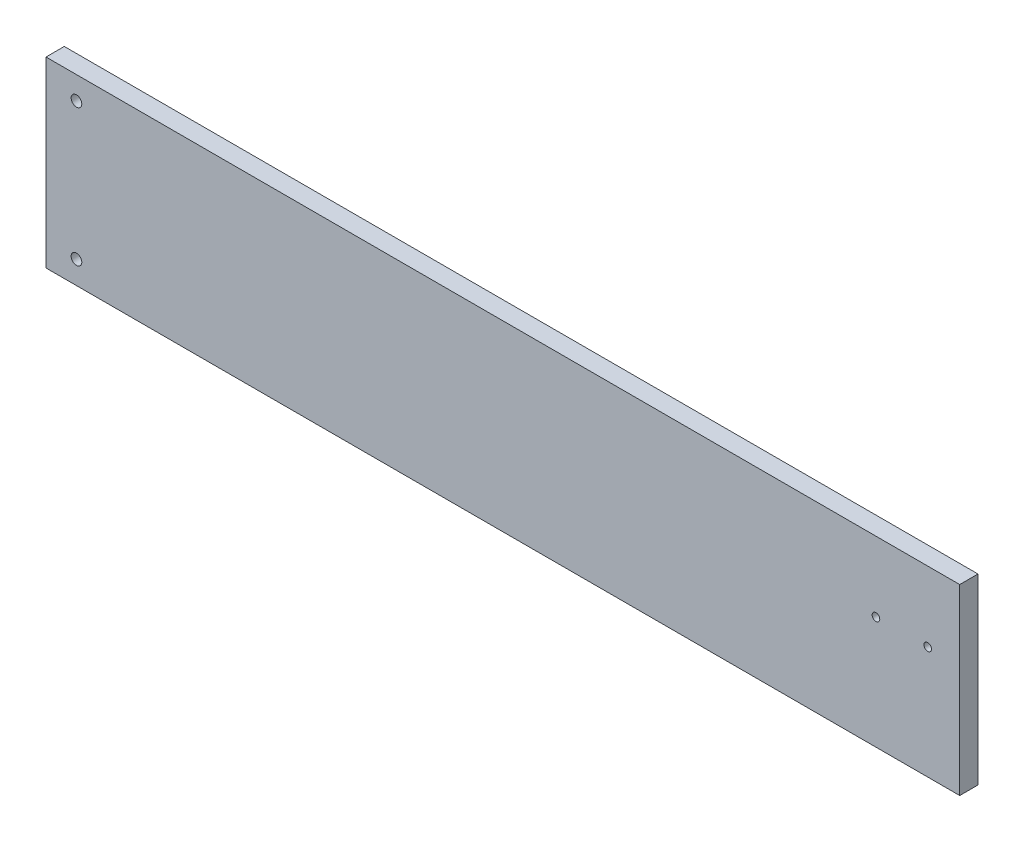
ISO-10303-21;
HEADER;
FILE_DESCRIPTION(('STEP AP214'),'2;1');
FILE_NAME('part.step','',(''),(''),'','','');
FILE_SCHEMA(('AUTOMOTIVE_DESIGN { 1 0 10303 214 1 1 1 1 }'));
ENDSEC;
DATA;
#1=APPLICATION_CONTEXT('core data for automotive mechanical design processes');
#2=APPLICATION_PROTOCOL_DEFINITION('international standard','automotive_design',2000,#1);
#3=PRODUCT_CONTEXT('',#1,'mechanical');
#4=PRODUCT('Part','Part','',(#3));
#5=PRODUCT_RELATED_PRODUCT_CATEGORY('part','',(#4));
#6=PRODUCT_DEFINITION_FORMATION('','',#4);
#7=PRODUCT_DEFINITION_CONTEXT('part definition',#1,'design');
#8=PRODUCT_DEFINITION('design','',#6,#7);
#9=PRODUCT_DEFINITION_SHAPE('','',#8);
#10=(LENGTH_UNIT() NAMED_UNIT(*) SI_UNIT(.MILLI.,.METRE.));
#11=(NAMED_UNIT(*) PLANE_ANGLE_UNIT() SI_UNIT($,.RADIAN.));
#12=(NAMED_UNIT(*) SI_UNIT($,.STERADIAN.) SOLID_ANGLE_UNIT());
#13=UNCERTAINTY_MEASURE_WITH_UNIT(LENGTH_MEASURE(1.E-05),#10,'distance_accuracy_value','');
#14=(GEOMETRIC_REPRESENTATION_CONTEXT(3) GLOBAL_UNCERTAINTY_ASSIGNED_CONTEXT((#13)) GLOBAL_UNIT_ASSIGNED_CONTEXT((#10,
#11,#12)) REPRESENTATION_CONTEXT('',''));
#15=CARTESIAN_POINT('',(0.,0.,0.));
#16=DIRECTION('',(0.,0.,1.));
#17=DIRECTION('',(1.,0.,0.));
#18=AXIS2_PLACEMENT_3D('',#15,#16,#17);
#19=CARTESIAN_POINT('',(0.,0.,12.));
#20=DIRECTION('',(1.,0.,0.));
#21=DIRECTION('',(0.,0.,-1.));
#22=AXIS2_PLACEMENT_3D('',#19,#20,#21);
#23=PLANE('',#22);
#24=DIRECTION('',(0.,-1.,0.));
#25=VECTOR('',#24,1.);
#26=CARTESIAN_POINT('',(0.,0.,0.));
#27=LINE('',#26,#25);
#28=CARTESIAN_POINT('',(0.,120.,0.));
#29=VERTEX_POINT('',#28);
#30=CARTESIAN_POINT('',(0.,0.,0.));
#31=VERTEX_POINT('',#30);
#32=EDGE_CURVE('E98',#29,#31,#27,.T.);
#33=ORIENTED_EDGE('',*,*,#32,.T.);
#34=DIRECTION('',(0.,0.,-1.));
#35=VECTOR('',#34,1.);
#36=CARTESIAN_POINT('',(0.,0.,12.));
#37=LINE('',#36,#35);
#38=CARTESIAN_POINT('',(0.,0.,12.));
#39=VERTEX_POINT('',#38);
#40=EDGE_CURVE('E11',#39,#31,#37,.T.);
#41=ORIENTED_EDGE('',*,*,#40,.F.);
#42=DIRECTION('',(0.,-1.,0.));
#43=VECTOR('',#42,1.);
#44=CARTESIAN_POINT('',(0.,0.,12.));
#45=LINE('',#44,#43);
#46=CARTESIAN_POINT('',(0.,120.,12.));
#47=VERTEX_POINT('',#46);
#48=EDGE_CURVE('E86',#47,#39,#45,.T.);
#49=ORIENTED_EDGE('',*,*,#48,.F.);
#50=DIRECTION('',(0.,0.,-1.));
#51=VECTOR('',#50,1.);
#52=CARTESIAN_POINT('',(0.,120.,12.));
#53=LINE('',#52,#51);
#54=EDGE_CURVE('E94',#47,#29,#53,.T.);
#55=ORIENTED_EDGE('',*,*,#54,.T.);
#56=EDGE_LOOP('',(#33,#41,#49,#55));
#57=FACE_BOUND('',#56,.T.);
#58=ADVANCED_FACE('F35',(#57),#23,.F.);
#59=CARTESIAN_POINT('',(0.,0.,12.));
#60=DIRECTION('',(0.,1.,0.));
#61=DIRECTION('',(0.,0.,1.));
#62=AXIS2_PLACEMENT_3D('',#59,#60,#61);
#63=PLANE('',#62);
#64=DIRECTION('',(1.,0.,0.));
#65=VECTOR('',#64,1.);
#66=CARTESIAN_POINT('',(0.,0.,0.));
#67=LINE('',#66,#65);
#68=CARTESIAN_POINT('',(600.,0.,0.));
#69=VERTEX_POINT('',#68);
#70=EDGE_CURVE('E90',#31,#69,#67,.T.);
#71=ORIENTED_EDGE('',*,*,#70,.T.);
#72=DIRECTION('',(0.,0.,-1.));
#73=VECTOR('',#72,1.);
#74=CARTESIAN_POINT('',(600.,0.,12.));
#75=LINE('',#74,#73);
#76=CARTESIAN_POINT('',(600.,0.,12.));
#77=VERTEX_POINT('',#76);
#78=EDGE_CURVE('E43',#77,#69,#75,.T.);
#79=ORIENTED_EDGE('',*,*,#78,.F.);
#80=DIRECTION('',(1.,0.,0.));
#81=VECTOR('',#80,1.);
#82=CARTESIAN_POINT('',(0.,0.,12.));
#83=LINE('',#82,#81);
#84=EDGE_CURVE('E81',#39,#77,#83,.T.);
#85=ORIENTED_EDGE('',*,*,#84,.F.);
#86=ORIENTED_EDGE('',*,*,#40,.T.);
#87=EDGE_LOOP('',(#71,#79,#85,#86));
#88=FACE_BOUND('',#87,.T.);
#89=ADVANCED_FACE('F89',(#88),#63,.F.);
#90=CARTESIAN_POINT('',(600.,0.,12.));
#91=DIRECTION('',(-1.,0.,0.));
#92=DIRECTION('',(0.,0.,1.));
#93=AXIS2_PLACEMENT_3D('',#90,#91,#92);
#94=PLANE('',#93);
#95=DIRECTION('',(0.,1.,0.));
#96=VECTOR('',#95,1.);
#97=CARTESIAN_POINT('',(600.,0.,0.));
#98=LINE('',#97,#96);
#99=CARTESIAN_POINT('',(600.,120.,0.));
#100=VERTEX_POINT('',#99);
#101=EDGE_CURVE('E68',#69,#100,#98,.T.);
#102=ORIENTED_EDGE('',*,*,#101,.T.);
#103=DIRECTION('',(0.,0.,-1.));
#104=VECTOR('',#103,1.);
#105=CARTESIAN_POINT('',(600.,120.,12.));
#106=LINE('',#105,#104);
#107=CARTESIAN_POINT('',(600.,120.,12.));
#108=VERTEX_POINT('',#107);
#109=EDGE_CURVE('E91',#108,#100,#106,.T.);
#110=ORIENTED_EDGE('',*,*,#109,.F.);
#111=DIRECTION('',(0.,1.,0.));
#112=VECTOR('',#111,1.);
#113=CARTESIAN_POINT('',(600.,0.,12.));
#114=LINE('',#113,#112);
#115=EDGE_CURVE('E84',#77,#108,#114,.T.);
#116=ORIENTED_EDGE('',*,*,#115,.F.);
#117=ORIENTED_EDGE('',*,*,#78,.T.);
#118=EDGE_LOOP('',(#102,#110,#116,#117));
#119=FACE_BOUND('',#118,.T.);
#120=ADVANCED_FACE('F92',(#119),#94,.F.);
#121=CARTESIAN_POINT('',(0.,120.,12.));
#122=DIRECTION('',(0.,-1.,0.));
#123=DIRECTION('',(0.,0.,-1.));
#124=AXIS2_PLACEMENT_3D('',#121,#122,#123);
#125=PLANE('',#124);
#126=DIRECTION('',(-1.,0.,0.));
#127=VECTOR('',#126,1.);
#128=CARTESIAN_POINT('',(0.,120.,0.));
#129=LINE('',#128,#127);
#130=EDGE_CURVE('E74',#100,#29,#129,.T.);
#131=ORIENTED_EDGE('',*,*,#130,.T.);
#132=ORIENTED_EDGE('',*,*,#54,.F.);
#133=DIRECTION('',(-1.,0.,0.));
#134=VECTOR('',#133,1.);
#135=CARTESIAN_POINT('',(0.,120.,12.));
#136=LINE('',#135,#134);
#137=EDGE_CURVE('E51',#108,#47,#136,.T.);
#138=ORIENTED_EDGE('',*,*,#137,.F.);
#139=ORIENTED_EDGE('',*,*,#109,.T.);
#140=EDGE_LOOP('',(#131,#132,#138,#139));
#141=FACE_BOUND('',#140,.T.);
#142=ADVANCED_FACE('F106',(#141),#125,.F.);
#143=CARTESIAN_POINT('',(0.,120.,12.));
#144=DIRECTION('',(0.,0.,-1.));
#145=DIRECTION('',(-1.,0.,0.));
#146=AXIS2_PLACEMENT_3D('',#143,#144,#145);
#147=PLANE('',#146);
#148=CARTESIAN_POINT('',(579.,74.,12.0000000000004));
#149=DIRECTION('',(0.,0.,-1.));
#150=DIRECTION('',(-1.,0.,0.));
#151=AXIS2_PLACEMENT_3D('',#148,#149,#150);
#152=CIRCLE('',#151,2.49999999999995);
#153=CARTESIAN_POINT('',(576.5,74.,12.0000000000004));
#154=VERTEX_POINT('',#153);
#155=EDGE_CURVE('E129',#154,#154,#152,.T.);
#156=ORIENTED_EDGE('',*,*,#155,.T.);
#157=EDGE_LOOP('',(#156));
#158=FACE_BOUND('',#157,.T.);
#159=CARTESIAN_POINT('',(545.,74.,12.0000000000004));
#160=DIRECTION('',(0.,0.,-1.));
#161=DIRECTION('',(-1.,0.,0.));
#162=AXIS2_PLACEMENT_3D('',#159,#160,#161);
#163=CIRCLE('',#162,2.49999999999995);
#164=CARTESIAN_POINT('',(542.5,74.,12.0000000000004));
#165=VERTEX_POINT('',#164);
#166=EDGE_CURVE('E121',#165,#165,#163,.T.);
#167=ORIENTED_EDGE('',*,*,#166,.T.);
#168=EDGE_LOOP('',(#167));
#169=FACE_BOUND('',#168,.T.);
#170=CARTESIAN_POINT('',(20.,105.,12.));
#171=DIRECTION('',(0.,0.,-1.));
#172=DIRECTION('',(1.,0.,0.));
#173=AXIS2_PLACEMENT_3D('',#170,#171,#172);
#174=CIRCLE('',#173,3.5);
#175=CARTESIAN_POINT('',(23.5,105.,12.));
#176=VERTEX_POINT('',#175);
#177=EDGE_CURVE('E115',#176,#176,#174,.T.);
#178=ORIENTED_EDGE('',*,*,#177,.T.);
#179=EDGE_LOOP('',(#178));
#180=FACE_BOUND('',#179,.T.);
#181=CARTESIAN_POINT('',(20.,15.,12.));
#182=DIRECTION('',(0.,0.,-1.));
#183=DIRECTION('',(-1.,0.,0.));
#184=AXIS2_PLACEMENT_3D('',#181,#182,#183);
#185=CIRCLE('',#184,3.5);
#186=CARTESIAN_POINT('',(16.5,15.,12.));
#187=VERTEX_POINT('',#186);
#188=EDGE_CURVE('E101',#187,#187,#185,.T.);
#189=ORIENTED_EDGE('',*,*,#188,.T.);
#190=EDGE_LOOP('',(#189));
#191=FACE_BOUND('',#190,.T.);
#192=ORIENTED_EDGE('',*,*,#48,.T.);
#193=ORIENTED_EDGE('',*,*,#84,.T.);
#194=ORIENTED_EDGE('',*,*,#115,.T.);
#195=ORIENTED_EDGE('',*,*,#137,.T.);
#196=EDGE_LOOP('',(#192,#193,#194,#195));
#197=FACE_BOUND('',#196,.T.);
#198=ADVANCED_FACE('F82',(#158,#169,#180,#191,#197),#147,.F.);
#199=CARTESIAN_POINT('',(0.,120.,0.));
#200=DIRECTION('',(0.,0.,-1.));
#201=DIRECTION('',(-1.,0.,0.));
#202=AXIS2_PLACEMENT_3D('',#199,#200,#201);
#203=PLANE('',#202);
#204=CARTESIAN_POINT('',(579.,74.,0.));
#205=DIRECTION('',(0.,0.,-1.));
#206=DIRECTION('',(-1.,0.,0.));
#207=AXIS2_PLACEMENT_3D('',#204,#205,#206);
#208=CIRCLE('',#207,2.49999999999995);
#209=CARTESIAN_POINT('',(576.5,74.,0.));
#210=VERTEX_POINT('',#209);
#211=EDGE_CURVE('E132',#210,#210,#208,.T.);
#212=ORIENTED_EDGE('',*,*,#211,.F.);
#213=EDGE_LOOP('',(#212));
#214=FACE_BOUND('',#213,.T.);
#215=CARTESIAN_POINT('',(545.,74.,0.));
#216=DIRECTION('',(0.,0.,-1.));
#217=DIRECTION('',(-1.,0.,0.));
#218=AXIS2_PLACEMENT_3D('',#215,#216,#217);
#219=CIRCLE('',#218,2.49999999999995);
#220=CARTESIAN_POINT('',(542.5,74.,0.));
#221=VERTEX_POINT('',#220);
#222=EDGE_CURVE('E126',#221,#221,#219,.T.);
#223=ORIENTED_EDGE('',*,*,#222,.F.);
#224=EDGE_LOOP('',(#223));
#225=FACE_BOUND('',#224,.T.);
#226=CARTESIAN_POINT('',(20.,105.,0.));
#227=DIRECTION('',(0.,0.,-1.));
#228=DIRECTION('',(1.,0.,0.));
#229=AXIS2_PLACEMENT_3D('',#226,#227,#228);
#230=CIRCLE('',#229,3.5);
#231=CARTESIAN_POINT('',(23.5,105.,0.));
#232=VERTEX_POINT('',#231);
#233=EDGE_CURVE('E118',#232,#232,#230,.T.);
#234=ORIENTED_EDGE('',*,*,#233,.F.);
#235=EDGE_LOOP('',(#234));
#236=FACE_BOUND('',#235,.T.);
#237=CARTESIAN_POINT('',(20.,15.,0.));
#238=DIRECTION('',(0.,0.,-1.));
#239=DIRECTION('',(-1.,0.,0.));
#240=AXIS2_PLACEMENT_3D('',#237,#238,#239);
#241=CIRCLE('',#240,3.5);
#242=CARTESIAN_POINT('',(16.5,15.,0.));
#243=VERTEX_POINT('',#242);
#244=EDGE_CURVE('E112',#243,#243,#241,.T.);
#245=ORIENTED_EDGE('',*,*,#244,.F.);
#246=EDGE_LOOP('',(#245));
#247=FACE_BOUND('',#246,.T.);
#248=ORIENTED_EDGE('',*,*,#32,.F.);
#249=ORIENTED_EDGE('',*,*,#130,.F.);
#250=ORIENTED_EDGE('',*,*,#101,.F.);
#251=ORIENTED_EDGE('',*,*,#70,.F.);
#252=EDGE_LOOP('',(#248,#249,#250,#251));
#253=FACE_BOUND('',#252,.T.);
#254=ADVANCED_FACE('F109',(#214,#225,#236,#247,#253),#203,.T.);
#255=CARTESIAN_POINT('',(20.,15.,12.));
#256=DIRECTION('',(0.,0.,-1.));
#257=DIRECTION('',(-1.,0.,0.));
#258=AXIS2_PLACEMENT_3D('',#255,#256,#257);
#259=CYLINDRICAL_SURFACE('',#258,3.5);
#260=ORIENTED_EDGE('',*,*,#188,.F.);
#261=EDGE_LOOP('',(#260));
#262=FACE_BOUND('',#261,.T.);
#263=ORIENTED_EDGE('',*,*,#244,.T.);
#264=EDGE_LOOP('',(#263));
#265=FACE_BOUND('',#264,.T.);
#266=ADVANCED_FACE('F140',(#262,#265),#259,.F.);
#267=CARTESIAN_POINT('',(20.,105.,12.));
#268=DIRECTION('',(0.,0.,-1.));
#269=DIRECTION('',(-1.,0.,0.));
#270=AXIS2_PLACEMENT_3D('',#267,#268,#269);
#271=CYLINDRICAL_SURFACE('',#270,3.5);
#272=ORIENTED_EDGE('',*,*,#177,.F.);
#273=EDGE_LOOP('',(#272));
#274=FACE_BOUND('',#273,.T.);
#275=ORIENTED_EDGE('',*,*,#233,.T.);
#276=EDGE_LOOP('',(#275));
#277=FACE_BOUND('',#276,.T.);
#278=ADVANCED_FACE('F149',(#274,#277),#271,.F.);
#279=CARTESIAN_POINT('',(545.,74.,0.));
#280=DIRECTION('',(0.,0.,-1.));
#281=DIRECTION('',(-1.,0.,0.));
#282=AXIS2_PLACEMENT_3D('',#279,#280,#281);
#283=CYLINDRICAL_SURFACE('',#282,2.49999999999995);
#284=ORIENTED_EDGE('',*,*,#166,.F.);
#285=EDGE_LOOP('',(#284));
#286=FACE_BOUND('',#285,.T.);
#287=ORIENTED_EDGE('',*,*,#222,.T.);
#288=EDGE_LOOP('',(#287));
#289=FACE_BOUND('',#288,.T.);
#290=ADVANCED_FACE('F156',(#286,#289),#283,.F.);
#291=CARTESIAN_POINT('',(579.,74.,0.));
#292=DIRECTION('',(0.,0.,-1.));
#293=DIRECTION('',(-1.,0.,0.));
#294=AXIS2_PLACEMENT_3D('',#291,#292,#293);
#295=CYLINDRICAL_SURFACE('',#294,2.49999999999995);
#296=ORIENTED_EDGE('',*,*,#155,.F.);
#297=EDGE_LOOP('',(#296));
#298=FACE_BOUND('',#297,.T.);
#299=ORIENTED_EDGE('',*,*,#211,.T.);
#300=EDGE_LOOP('',(#299));
#301=FACE_BOUND('',#300,.T.);
#302=ADVANCED_FACE('F136',(#298,#301),#295,.F.);
#303=CLOSED_SHELL('',(#58,#89,#120,#142,#198,#254,#266,#278,#290,#302));
#304=MANIFOLD_SOLID_BREP('B2',#303);
#305=ADVANCED_BREP_SHAPE_REPRESENTATION('',(#18,#304),#14);
#306=SHAPE_DEFINITION_REPRESENTATION(#9,#305);
ENDSEC;
END-ISO-10303-21;
